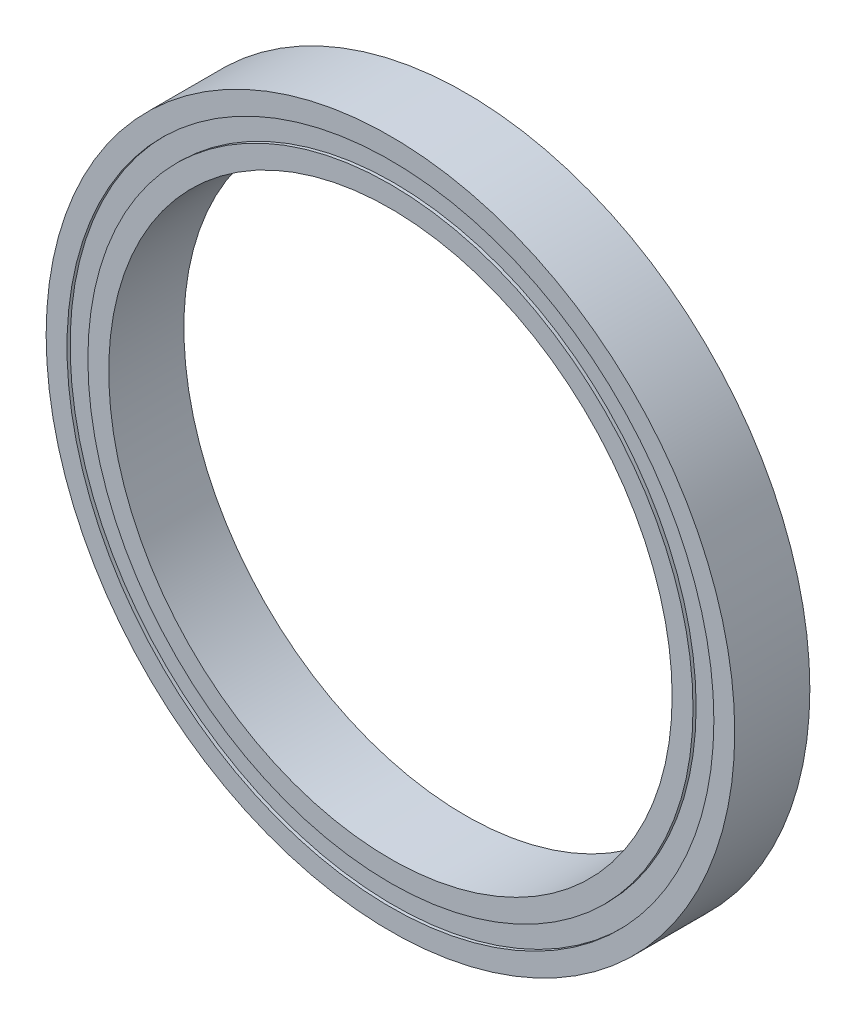
ISO-10303-21;
HEADER;
FILE_DESCRIPTION(('STEP AP214'),'2;1');
FILE_NAME('part.step','',(''),(''),'','','');
FILE_SCHEMA(('AUTOMOTIVE_DESIGN { 1 0 10303 214 1 1 1 1 }'));
ENDSEC;
DATA;
#1=APPLICATION_CONTEXT('core data for automotive mechanical design processes');
#2=APPLICATION_PROTOCOL_DEFINITION('international standard','automotive_design',2000,#1);
#3=PRODUCT_CONTEXT('',#1,'mechanical');
#4=PRODUCT('Part','Part','',(#3));
#5=PRODUCT_RELATED_PRODUCT_CATEGORY('part','',(#4));
#6=PRODUCT_DEFINITION_FORMATION('','',#4);
#7=PRODUCT_DEFINITION_CONTEXT('part definition',#1,'design');
#8=PRODUCT_DEFINITION('design','',#6,#7);
#9=PRODUCT_DEFINITION_SHAPE('','',#8);
#10=(LENGTH_UNIT() NAMED_UNIT(*) SI_UNIT(.MILLI.,.METRE.));
#11=(NAMED_UNIT(*) PLANE_ANGLE_UNIT() SI_UNIT($,.RADIAN.));
#12=(NAMED_UNIT(*) SI_UNIT($,.STERADIAN.) SOLID_ANGLE_UNIT());
#13=UNCERTAINTY_MEASURE_WITH_UNIT(LENGTH_MEASURE(1.E-05),#10,'distance_accuracy_value','');
#14=(GEOMETRIC_REPRESENTATION_CONTEXT(3) GLOBAL_UNCERTAINTY_ASSIGNED_CONTEXT((#13)) GLOBAL_UNIT_ASSIGNED_CONTEXT((#10,
#11,#12)) REPRESENTATION_CONTEXT('',''));
#15=CARTESIAN_POINT('',(0.,0.,0.));
#16=DIRECTION('',(0.,0.,1.));
#17=DIRECTION('',(1.,0.,0.));
#18=AXIS2_PLACEMENT_3D('',#15,#16,#17);
#19=CARTESIAN_POINT('',(0.,0.,-3.));
#20=DIRECTION('',(0.,0.,1.));
#21=DIRECTION('',(1.,0.,0.));
#22=AXIS2_PLACEMENT_3D('',#19,#20,#21);
#23=CYLINDRICAL_SURFACE('',#22,24.1666666666667);
#24=CARTESIAN_POINT('',(0.,0.,-3.));
#25=DIRECTION('',(0.,0.,1.));
#26=DIRECTION('',(1.,0.,0.));
#27=AXIS2_PLACEMENT_3D('',#24,#25,#26);
#28=CIRCLE('',#27,24.1666666666667);
#29=CARTESIAN_POINT('',(24.1666666666667,0.,-3.));
#30=VERTEX_POINT('',#29);
#31=EDGE_CURVE('E53',#30,#30,#28,.T.);
#32=ORIENTED_EDGE('',*,*,#31,.T.);
#33=EDGE_LOOP('',(#32));
#34=FACE_BOUND('',#33,.T.);
#35=CARTESIAN_POINT('',(0.,0.,-2.75));
#36=DIRECTION('',(0.,0.,1.));
#37=DIRECTION('',(1.,0.,0.));
#38=AXIS2_PLACEMENT_3D('',#35,#36,#37);
#39=CIRCLE('',#38,24.1666666666667);
#40=CARTESIAN_POINT('',(24.1666666666667,0.,-2.75));
#41=VERTEX_POINT('',#40);
#42=EDGE_CURVE('E72',#41,#41,#39,.T.);
#43=ORIENTED_EDGE('',*,*,#42,.F.);
#44=EDGE_LOOP('',(#43));
#45=FACE_BOUND('',#44,.T.);
#46=ADVANCED_FACE('F46',(#34,#45),#23,.T.);
#47=CARTESIAN_POINT('',(0.,0.,-3.));
#48=DIRECTION('',(0.,0.,1.));
#49=DIRECTION('',(1.,0.,0.));
#50=AXIS2_PLACEMENT_3D('',#47,#48,#49);
#51=CYLINDRICAL_SURFACE('',#50,22.5);
#52=CARTESIAN_POINT('',(0.,0.,-3.));
#53=DIRECTION('',(0.,0.,1.));
#54=DIRECTION('',(1.,0.,0.));
#55=AXIS2_PLACEMENT_3D('',#52,#53,#54);
#56=CIRCLE('',#55,22.5);
#57=CARTESIAN_POINT('',(22.5,0.,-3.));
#58=VERTEX_POINT('',#57);
#59=EDGE_CURVE('E57',#58,#58,#56,.T.);
#60=ORIENTED_EDGE('',*,*,#59,.F.);
#61=EDGE_LOOP('',(#60));
#62=FACE_BOUND('',#61,.T.);
#63=CARTESIAN_POINT('',(0.,0.,3.));
#64=DIRECTION('',(0.,0.,1.));
#65=DIRECTION('',(1.,0.,0.));
#66=AXIS2_PLACEMENT_3D('',#63,#64,#65);
#67=CIRCLE('',#66,22.5);
#68=CARTESIAN_POINT('',(22.5,0.,3.));
#69=VERTEX_POINT('',#68);
#70=EDGE_CURVE('E66',#69,#69,#67,.T.);
#71=ORIENTED_EDGE('',*,*,#70,.T.);
#72=EDGE_LOOP('',(#71));
#73=FACE_BOUND('',#72,.T.);
#74=ADVANCED_FACE('F48',(#62,#73),#51,.F.);
#75=CARTESIAN_POINT('',(0.,0.,2.75));
#76=DIRECTION('',(0.,0.,1.));
#77=DIRECTION('',(1.,0.,0.));
#78=AXIS2_PLACEMENT_3D('',#75,#76,#77);
#79=CIRCLE('',#78,24.1666666666667);
#80=CARTESIAN_POINT('',(24.1666666666667,0.,2.75));
#81=VERTEX_POINT('',#80);
#82=EDGE_CURVE('E11',#81,#81,#79,.F.);
#83=ORIENTED_EDGE('',*,*,#82,.F.);
#84=EDGE_LOOP('',(#83));
#85=FACE_BOUND('',#84,.T.);
#86=CARTESIAN_POINT('',(0.,0.,3.));
#87=DIRECTION('',(0.,0.,1.));
#88=DIRECTION('',(1.,0.,0.));
#89=AXIS2_PLACEMENT_3D('',#86,#87,#88);
#90=CIRCLE('',#89,24.1666666666667);
#91=CARTESIAN_POINT('',(24.1666666666667,0.,3.));
#92=VERTEX_POINT('',#91);
#93=EDGE_CURVE('E61',#92,#92,#90,.T.);
#94=ORIENTED_EDGE('',*,*,#93,.F.);
#95=EDGE_LOOP('',(#94));
#96=FACE_BOUND('',#95,.T.);
#97=ADVANCED_FACE('F114',(#85,#96),#23,.T.);
#98=CARTESIAN_POINT('',(0.,0.,-3.));
#99=DIRECTION('',(0.,0.,1.));
#100=DIRECTION('',(1.,0.,0.));
#101=AXIS2_PLACEMENT_3D('',#98,#99,#100);
#102=PLANE('',#101);
#103=ORIENTED_EDGE('',*,*,#59,.T.);
#104=EDGE_LOOP('',(#103));
#105=FACE_BOUND('',#104,.T.);
#106=ORIENTED_EDGE('',*,*,#31,.F.);
#107=EDGE_LOOP('',(#106));
#108=FACE_BOUND('',#107,.T.);
#109=ADVANCED_FACE('F122',(#105,#108),#102,.F.);
#110=CARTESIAN_POINT('',(0.,0.,3.));
#111=DIRECTION('',(0.,0.,1.));
#112=DIRECTION('',(1.,0.,0.));
#113=AXIS2_PLACEMENT_3D('',#110,#111,#112);
#114=PLANE('',#113);
#115=ORIENTED_EDGE('',*,*,#70,.F.);
#116=EDGE_LOOP('',(#115));
#117=FACE_BOUND('',#116,.T.);
#118=ORIENTED_EDGE('',*,*,#93,.T.);
#119=EDGE_LOOP('',(#118));
#120=FACE_BOUND('',#119,.T.);
#121=ADVANCED_FACE('F127',(#117,#120),#114,.T.);
#122=CARTESIAN_POINT('',(0.,0.,-2.75));
#123=DIRECTION('',(0.,0.,1.));
#124=DIRECTION('',(1.,0.,0.));
#125=AXIS2_PLACEMENT_3D('',#122,#123,#124);
#126=PLANE('',#125);
#127=ORIENTED_EDGE('',*,*,#42,.T.);
#128=EDGE_LOOP('',(#127));
#129=FACE_BOUND('',#128,.T.);
#130=CARTESIAN_POINT('',(0.,0.,-2.75));
#131=DIRECTION('',(0.,0.,1.));
#132=DIRECTION('',(1.,0.,0.));
#133=AXIS2_PLACEMENT_3D('',#130,#131,#132);
#134=CIRCLE('',#133,25.8333333333333);
#135=CARTESIAN_POINT('',(25.8333333333333,0.,-2.75));
#136=VERTEX_POINT('',#135);
#137=EDGE_CURVE('E69',#136,#136,#134,.T.);
#138=ORIENTED_EDGE('',*,*,#137,.F.);
#139=EDGE_LOOP('',(#138));
#140=FACE_BOUND('',#139,.T.);
#141=ADVANCED_FACE('F133',(#129,#140),#126,.F.);
#142=CARTESIAN_POINT('',(0.,0.,2.75));
#143=DIRECTION('',(0.,0.,1.));
#144=DIRECTION('',(1.,0.,0.));
#145=AXIS2_PLACEMENT_3D('',#142,#143,#144);
#146=PLANE('',#145);
#147=ORIENTED_EDGE('',*,*,#82,.T.);
#148=EDGE_LOOP('',(#147));
#149=FACE_BOUND('',#148,.T.);
#150=CARTESIAN_POINT('',(0.,0.,2.75));
#151=DIRECTION('',(0.,0.,1.));
#152=DIRECTION('',(1.,0.,0.));
#153=AXIS2_PLACEMENT_3D('',#150,#151,#152);
#154=CIRCLE('',#153,25.8333333333333);
#155=CARTESIAN_POINT('',(25.8333333333333,0.,2.75));
#156=VERTEX_POINT('',#155);
#157=EDGE_CURVE('E75',#156,#156,#154,.T.);
#158=ORIENTED_EDGE('',*,*,#157,.T.);
#159=EDGE_LOOP('',(#158));
#160=FACE_BOUND('',#159,.T.);
#161=ADVANCED_FACE('F139',(#149,#160),#146,.T.);
#162=CARTESIAN_POINT('',(0.,0.,-3.));
#163=DIRECTION('',(0.,0.,1.));
#164=DIRECTION('',(1.,0.,0.));
#165=AXIS2_PLACEMENT_3D('',#162,#163,#164);
#166=CYLINDRICAL_SURFACE('',#165,25.8333333333333);
#167=CARTESIAN_POINT('',(0.,0.,-3.));
#168=DIRECTION('',(0.,0.,1.));
#169=DIRECTION('',(1.,0.,0.));
#170=AXIS2_PLACEMENT_3D('',#167,#168,#169);
#171=CIRCLE('',#170,25.8333333333333);
#172=CARTESIAN_POINT('',(25.8333333333333,0.,-3.));
#173=VERTEX_POINT('',#172);
#174=EDGE_CURVE('E81',#173,#173,#171,.T.);
#175=ORIENTED_EDGE('',*,*,#174,.F.);
#176=EDGE_LOOP('',(#175));
#177=FACE_BOUND('',#176,.T.);
#178=ORIENTED_EDGE('',*,*,#137,.T.);
#179=EDGE_LOOP('',(#178));
#180=FACE_BOUND('',#179,.T.);
#181=ADVANCED_FACE('F110',(#177,#180),#166,.F.);
#182=ORIENTED_EDGE('',*,*,#157,.F.);
#183=EDGE_LOOP('',(#182));
#184=FACE_BOUND('',#183,.T.);
#185=CARTESIAN_POINT('',(0.,0.,3.));
#186=DIRECTION('',(0.,0.,1.));
#187=DIRECTION('',(1.,0.,0.));
#188=AXIS2_PLACEMENT_3D('',#185,#186,#187);
#189=CIRCLE('',#188,25.8333333333333);
#190=CARTESIAN_POINT('',(25.8333333333333,0.,3.));
#191=VERTEX_POINT('',#190);
#192=EDGE_CURVE('E87',#191,#191,#189,.T.);
#193=ORIENTED_EDGE('',*,*,#192,.T.);
#194=EDGE_LOOP('',(#193));
#195=FACE_BOUND('',#194,.T.);
#196=ADVANCED_FACE('F91',(#184,#195),#166,.F.);
#197=CARTESIAN_POINT('',(0.,0.,-3.));
#198=DIRECTION('',(0.,0.,1.));
#199=DIRECTION('',(1.,0.,0.));
#200=AXIS2_PLACEMENT_3D('',#197,#198,#199);
#201=CYLINDRICAL_SURFACE('',#200,27.5);
#202=CARTESIAN_POINT('',(0.,0.,-3.));
#203=DIRECTION('',(0.,0.,1.));
#204=DIRECTION('',(1.,0.,0.));
#205=AXIS2_PLACEMENT_3D('',#202,#203,#204);
#206=CIRCLE('',#205,27.5);
#207=CARTESIAN_POINT('',(27.5,0.,-3.));
#208=VERTEX_POINT('',#207);
#209=EDGE_CURVE('E78',#208,#208,#206,.T.);
#210=ORIENTED_EDGE('',*,*,#209,.T.);
#211=EDGE_LOOP('',(#210));
#212=FACE_BOUND('',#211,.T.);
#213=CARTESIAN_POINT('',(0.,0.,3.));
#214=DIRECTION('',(0.,0.,1.));
#215=DIRECTION('',(1.,0.,0.));
#216=AXIS2_PLACEMENT_3D('',#213,#214,#215);
#217=CIRCLE('',#216,27.5);
#218=CARTESIAN_POINT('',(27.5,0.,3.));
#219=VERTEX_POINT('',#218);
#220=EDGE_CURVE('E84',#219,#219,#217,.T.);
#221=ORIENTED_EDGE('',*,*,#220,.F.);
#222=EDGE_LOOP('',(#221));
#223=FACE_BOUND('',#222,.T.);
#224=ADVANCED_FACE('F100',(#212,#223),#201,.T.);
#225=CARTESIAN_POINT('',(0.,0.,-3.));
#226=DIRECTION('',(0.,0.,1.));
#227=DIRECTION('',(1.,0.,0.));
#228=AXIS2_PLACEMENT_3D('',#225,#226,#227);
#229=PLANE('',#228);
#230=ORIENTED_EDGE('',*,*,#174,.T.);
#231=EDGE_LOOP('',(#230));
#232=FACE_BOUND('',#231,.T.);
#233=ORIENTED_EDGE('',*,*,#209,.F.);
#234=EDGE_LOOP('',(#233));
#235=FACE_BOUND('',#234,.T.);
#236=ADVANCED_FACE('F96',(#232,#235),#229,.F.);
#237=CARTESIAN_POINT('',(0.,0.,3.));
#238=DIRECTION('',(0.,0.,1.));
#239=DIRECTION('',(1.,0.,0.));
#240=AXIS2_PLACEMENT_3D('',#237,#238,#239);
#241=PLANE('',#240);
#242=ORIENTED_EDGE('',*,*,#192,.F.);
#243=EDGE_LOOP('',(#242));
#244=FACE_BOUND('',#243,.T.);
#245=ORIENTED_EDGE('',*,*,#220,.T.);
#246=EDGE_LOOP('',(#245));
#247=FACE_BOUND('',#246,.T.);
#248=ADVANCED_FACE('F93',(#244,#247),#241,.T.);
#249=CLOSED_SHELL('',(#46,#74,#97,#109,#121,#141,#161,#181,#196,#224,#236,#248));
#250=MANIFOLD_SOLID_BREP('B2',#249);
#251=ADVANCED_BREP_SHAPE_REPRESENTATION('',(#18,#250),#14);
#252=SHAPE_DEFINITION_REPRESENTATION(#9,#251);
ENDSEC;
END-ISO-10303-21;
